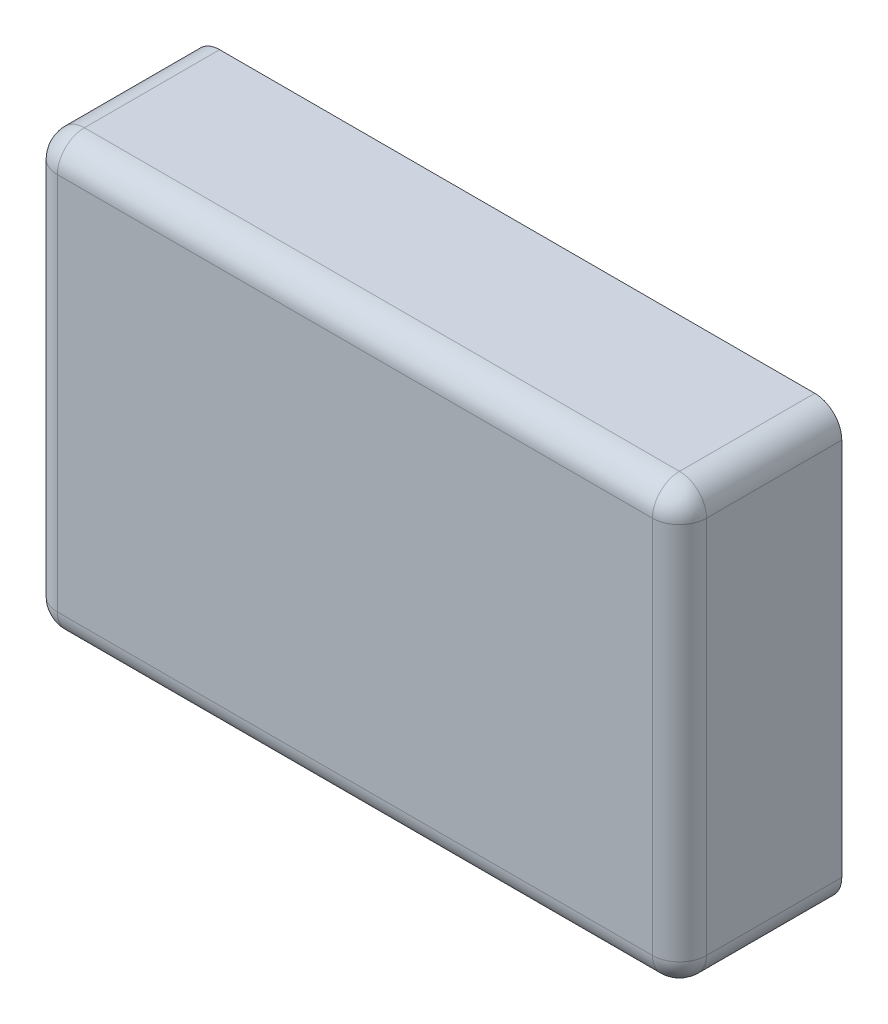
ISO-10303-21;
HEADER;
FILE_DESCRIPTION(('STEP AP214'),'2;1');
FILE_NAME('part.step','',(''),(''),'','','');
FILE_SCHEMA(('AUTOMOTIVE_DESIGN { 1 0 10303 214 1 1 1 1 }'));
ENDSEC;
DATA;
#1=APPLICATION_CONTEXT('core data for automotive mechanical design processes');
#2=APPLICATION_PROTOCOL_DEFINITION('international standard','automotive_design',2000,#1);
#3=PRODUCT_CONTEXT('',#1,'mechanical');
#4=PRODUCT('Part','Part','',(#3));
#5=PRODUCT_RELATED_PRODUCT_CATEGORY('part','',(#4));
#6=PRODUCT_DEFINITION_FORMATION('','',#4);
#7=PRODUCT_DEFINITION_CONTEXT('part definition',#1,'design');
#8=PRODUCT_DEFINITION('design','',#6,#7);
#9=PRODUCT_DEFINITION_SHAPE('','',#8);
#10=(LENGTH_UNIT() NAMED_UNIT(*) SI_UNIT(.MILLI.,.METRE.));
#11=(NAMED_UNIT(*) PLANE_ANGLE_UNIT() SI_UNIT($,.RADIAN.));
#12=(NAMED_UNIT(*) SI_UNIT($,.STERADIAN.) SOLID_ANGLE_UNIT());
#13=UNCERTAINTY_MEASURE_WITH_UNIT(LENGTH_MEASURE(1.E-05),#10,'distance_accuracy_value','');
#14=(GEOMETRIC_REPRESENTATION_CONTEXT(3) GLOBAL_UNCERTAINTY_ASSIGNED_CONTEXT((#13)) GLOBAL_UNIT_ASSIGNED_CONTEXT((#10,
#11,#12)) REPRESENTATION_CONTEXT('',''));
#15=CARTESIAN_POINT('',(0.,0.,0.));
#16=DIRECTION('',(0.,0.,1.));
#17=DIRECTION('',(1.,0.,0.));
#18=AXIS2_PLACEMENT_3D('',#15,#16,#17);
#19=CARTESIAN_POINT('',(0.55,-0.4,0.55));
#20=DIRECTION('',(0.,1.,0.));
#21=DIRECTION('',(1.,0.,0.));
#22=AXIS2_PLACEMENT_3D('',#19,#20,#21);
#23=CYLINDRICAL_SURFACE('',#22,0.05);
#24=CARTESIAN_POINT('',(0.55,-0.35,0.55));
#25=DIRECTION('',(0.,1.,0.));
#26=DIRECTION('',(1.,0.,0.));
#27=AXIS2_PLACEMENT_3D('',#24,#25,#26);
#28=CIRCLE('',#27,0.05);
#29=CARTESIAN_POINT('',(0.55,-0.35,0.6));
#30=VERTEX_POINT('',#29);
#31=CARTESIAN_POINT('',(0.6,-0.35,0.55));
#32=VERTEX_POINT('',#31);
#33=EDGE_CURVE('E27',#30,#32,#28,.T.);
#34=ORIENTED_EDGE('',*,*,#33,.T.);
#35=DIRECTION('',(0.,1.,0.));
#36=VECTOR('',#35,1.);
#37=CARTESIAN_POINT('',(0.6,-0.4,0.55));
#38=LINE('',#37,#36);
#39=CARTESIAN_POINT('',(0.6,0.35,0.55));
#40=VERTEX_POINT('',#39);
#41=EDGE_CURVE('E206',#32,#40,#38,.T.);
#42=ORIENTED_EDGE('',*,*,#41,.T.);
#43=CARTESIAN_POINT('',(0.55,0.35,0.55));
#44=DIRECTION('',(0.,-1.,0.));
#45=DIRECTION('',(1.,0.,0.));
#46=AXIS2_PLACEMENT_3D('',#43,#44,#45);
#47=CIRCLE('',#46,0.05);
#48=CARTESIAN_POINT('',(0.55,0.35,0.6));
#49=VERTEX_POINT('',#48);
#50=EDGE_CURVE('E11',#40,#49,#47,.T.);
#51=ORIENTED_EDGE('',*,*,#50,.T.);
#52=DIRECTION('',(0.,1.,0.));
#53=VECTOR('',#52,1.);
#54=CARTESIAN_POINT('',(0.55,-0.4,0.6));
#55=LINE('',#54,#53);
#56=EDGE_CURVE('E178',#30,#49,#55,.T.);
#57=ORIENTED_EDGE('',*,*,#56,.F.);
#58=EDGE_LOOP('',(#34,#42,#51,#57));
#59=FACE_BOUND('',#58,.T.);
#60=ADVANCED_FACE('F16',(#59),#23,.T.);
#61=CARTESIAN_POINT('',(0.55,0.35,0.55));
#62=DIRECTION('',(0.,-1.,0.));
#63=DIRECTION('',(1.,0.,0.));
#64=AXIS2_PLACEMENT_3D('',#61,#62,#63);
#65=SPHERICAL_SURFACE('',#64,0.05);
#66=CARTESIAN_POINT('',(0.55,0.35,0.55));
#67=DIRECTION('',(0.,0.,-1.));
#68=DIRECTION('',(1.,0.,0.));
#69=AXIS2_PLACEMENT_3D('',#66,#67,#68);
#70=CIRCLE('',#69,0.05);
#71=CARTESIAN_POINT('',(0.55,0.4,0.55));
#72=VERTEX_POINT('',#71);
#73=EDGE_CURVE('E184',#72,#40,#70,.T.);
#74=ORIENTED_EDGE('',*,*,#73,.F.);
#75=CARTESIAN_POINT('',(0.55,0.35,0.55));
#76=DIRECTION('',(1.,0.,0.));
#77=DIRECTION('',(0.,0.,1.));
#78=AXIS2_PLACEMENT_3D('',#75,#76,#77);
#79=CIRCLE('',#78,0.05);
#80=EDGE_CURVE('E196',#72,#49,#79,.T.);
#81=ORIENTED_EDGE('',*,*,#80,.T.);
#82=ORIENTED_EDGE('',*,*,#50,.F.);
#83=EDGE_LOOP('',(#74,#81,#82));
#84=FACE_BOUND('',#83,.T.);
#85=ADVANCED_FACE('F283',(#84),#65,.T.);
#86=CARTESIAN_POINT('',(0.55,-0.35,0.55));
#87=DIRECTION('',(0.,0.,-1.));
#88=DIRECTION('',(1.,0.,0.));
#89=AXIS2_PLACEMENT_3D('',#86,#87,#88);
#90=SPHERICAL_SURFACE('',#89,0.05);
#91=ORIENTED_EDGE('',*,*,#33,.F.);
#92=CARTESIAN_POINT('',(0.55,-0.35,0.55));
#93=DIRECTION('',(1.,0.,0.));
#94=DIRECTION('',(0.,-1.,0.));
#95=AXIS2_PLACEMENT_3D('',#92,#93,#94);
#96=CIRCLE('',#95,0.05);
#97=CARTESIAN_POINT('',(0.55,-0.4,0.55));
#98=VERTEX_POINT('',#97);
#99=EDGE_CURVE('E192',#30,#98,#96,.T.);
#100=ORIENTED_EDGE('',*,*,#99,.T.);
#101=CARTESIAN_POINT('',(0.55,-0.35,0.55));
#102=DIRECTION('',(0.,0.,-1.));
#103=DIRECTION('',(1.,0.,0.));
#104=AXIS2_PLACEMENT_3D('',#101,#102,#103);
#105=CIRCLE('',#104,0.05);
#106=EDGE_CURVE('E172',#32,#98,#105,.T.);
#107=ORIENTED_EDGE('',*,*,#106,.F.);
#108=EDGE_LOOP('',(#91,#100,#107));
#109=FACE_BOUND('',#108,.T.);
#110=ADVANCED_FACE('F267',(#109),#90,.T.);
#111=CARTESIAN_POINT('',(-0.6,0.35,0.55));
#112=DIRECTION('',(1.,0.,0.));
#113=DIRECTION('',(0.,1.,0.));
#114=AXIS2_PLACEMENT_3D('',#111,#112,#113);
#115=CYLINDRICAL_SURFACE('',#114,0.05);
#116=CARTESIAN_POINT('',(-0.55,0.35,0.55));
#117=DIRECTION('',(1.,0.,0.));
#118=DIRECTION('',(0.,0.,1.));
#119=AXIS2_PLACEMENT_3D('',#116,#117,#118);
#120=CIRCLE('',#119,0.05);
#121=CARTESIAN_POINT('',(-0.55,0.4,0.55));
#122=VERTEX_POINT('',#121);
#123=CARTESIAN_POINT('',(-0.55,0.35,0.6));
#124=VERTEX_POINT('',#123);
#125=EDGE_CURVE('E20',#122,#124,#120,.T.);
#126=ORIENTED_EDGE('',*,*,#125,.T.);
#127=DIRECTION('',(1.,0.,0.));
#128=VECTOR('',#127,1.);
#129=CARTESIAN_POINT('',(-0.6,0.35,0.6));
#130=LINE('',#129,#128);
#131=EDGE_CURVE('E182',#124,#49,#130,.T.);
#132=ORIENTED_EDGE('',*,*,#131,.T.);
#133=ORIENTED_EDGE('',*,*,#80,.F.);
#134=DIRECTION('',(1.,0.,0.));
#135=VECTOR('',#134,1.);
#136=CARTESIAN_POINT('',(-0.6,0.4,0.55));
#137=LINE('',#136,#135);
#138=EDGE_CURVE('E204',#122,#72,#137,.T.);
#139=ORIENTED_EDGE('',*,*,#138,.F.);
#140=EDGE_LOOP('',(#126,#132,#133,#139));
#141=FACE_BOUND('',#140,.T.);
#142=ADVANCED_FACE('F286',(#141),#115,.T.);
#143=CARTESIAN_POINT('',(-0.6,-0.35,0.55));
#144=DIRECTION('',(1.,0.,0.));
#145=DIRECTION('',(0.,-1.,0.));
#146=AXIS2_PLACEMENT_3D('',#143,#144,#145);
#147=CYLINDRICAL_SURFACE('',#146,0.05);
#148=CARTESIAN_POINT('',(-0.55,-0.35,0.55));
#149=DIRECTION('',(1.,0.,0.));
#150=DIRECTION('',(0.,-1.,0.));
#151=AXIS2_PLACEMENT_3D('',#148,#149,#150);
#152=CIRCLE('',#151,0.05);
#153=CARTESIAN_POINT('',(-0.55,-0.35,0.6));
#154=VERTEX_POINT('',#153);
#155=CARTESIAN_POINT('',(-0.55,-0.4,0.55));
#156=VERTEX_POINT('',#155);
#157=EDGE_CURVE('E117',#154,#156,#152,.T.);
#158=ORIENTED_EDGE('',*,*,#157,.T.);
#159=DIRECTION('',(1.,0.,0.));
#160=VECTOR('',#159,1.);
#161=CARTESIAN_POINT('',(-0.6,-0.4,0.55));
#162=LINE('',#161,#160);
#163=EDGE_CURVE('E231',#156,#98,#162,.T.);
#164=ORIENTED_EDGE('',*,*,#163,.T.);
#165=ORIENTED_EDGE('',*,*,#99,.F.);
#166=DIRECTION('',(1.,0.,0.));
#167=VECTOR('',#166,1.);
#168=CARTESIAN_POINT('',(-0.6,-0.35,0.6));
#169=LINE('',#168,#167);
#170=EDGE_CURVE('E183',#154,#30,#169,.T.);
#171=ORIENTED_EDGE('',*,*,#170,.F.);
#172=EDGE_LOOP('',(#158,#164,#165,#171));
#173=FACE_BOUND('',#172,.T.);
#174=ADVANCED_FACE('F290',(#173),#147,.T.);
#175=CARTESIAN_POINT('',(-0.6,-0.4,0.6));
#176=DIRECTION('',(0.,0.,1.));
#177=DIRECTION('',(1.,0.,0.));
#178=AXIS2_PLACEMENT_3D('',#175,#176,#177);
#179=PLANE('',#178);
#180=DIRECTION('',(0.,1.,0.));
#181=VECTOR('',#180,1.);
#182=CARTESIAN_POINT('',(-0.55,-0.4,0.6));
#183=LINE('',#182,#181);
#184=EDGE_CURVE('E123',#154,#124,#183,.T.);
#185=ORIENTED_EDGE('',*,*,#184,.F.);
#186=ORIENTED_EDGE('',*,*,#170,.T.);
#187=ORIENTED_EDGE('',*,*,#56,.T.);
#188=ORIENTED_EDGE('',*,*,#131,.F.);
#189=EDGE_LOOP('',(#185,#186,#187,#188));
#190=FACE_BOUND('',#189,.T.);
#191=ADVANCED_FACE('F289',(#190),#179,.T.);
#192=CARTESIAN_POINT('',(-0.55,0.35,0.55));
#193=DIRECTION('',(0.,-1.,0.));
#194=DIRECTION('',(-1.,0.,0.));
#195=AXIS2_PLACEMENT_3D('',#192,#193,#194);
#196=SPHERICAL_SURFACE('',#195,0.05);
#197=CARTESIAN_POINT('',(-0.55,0.35,0.55));
#198=DIRECTION('',(0.,0.,1.));
#199=DIRECTION('',(-1.,0.,0.));
#200=AXIS2_PLACEMENT_3D('',#197,#198,#199);
#201=CIRCLE('',#200,0.05);
#202=CARTESIAN_POINT('',(-0.6,0.35,0.55));
#203=VERTEX_POINT('',#202);
#204=EDGE_CURVE('E135',#122,#203,#201,.T.);
#205=ORIENTED_EDGE('',*,*,#204,.T.);
#206=CARTESIAN_POINT('',(-0.55,0.35,0.55));
#207=DIRECTION('',(0.,1.,0.));
#208=DIRECTION('',(-1.,0.,0.));
#209=AXIS2_PLACEMENT_3D('',#206,#207,#208);
#210=CIRCLE('',#209,0.05);
#211=EDGE_CURVE('E141',#203,#124,#210,.T.);
#212=ORIENTED_EDGE('',*,*,#211,.T.);
#213=ORIENTED_EDGE('',*,*,#125,.F.);
#214=EDGE_LOOP('',(#205,#212,#213));
#215=FACE_BOUND('',#214,.T.);
#216=ADVANCED_FACE('F18',(#215),#196,.T.);
#217=CARTESIAN_POINT('',(-0.55,-0.35,0.55));
#218=DIRECTION('',(0.,0.,-1.));
#219=DIRECTION('',(-1.,0.,0.));
#220=AXIS2_PLACEMENT_3D('',#217,#218,#219);
#221=SPHERICAL_SURFACE('',#220,0.05);
#222=CARTESIAN_POINT('',(-0.55,-0.35,0.55));
#223=DIRECTION('',(0.,-1.,0.));
#224=DIRECTION('',(-1.,0.,0.));
#225=AXIS2_PLACEMENT_3D('',#222,#223,#224);
#226=CIRCLE('',#225,0.05);
#227=CARTESIAN_POINT('',(-0.6,-0.35,0.55));
#228=VERTEX_POINT('',#227);
#229=EDGE_CURVE('E112',#154,#228,#226,.T.);
#230=ORIENTED_EDGE('',*,*,#229,.T.);
#231=CARTESIAN_POINT('',(-0.55,-0.35,0.55));
#232=DIRECTION('',(0.,0.,1.));
#233=DIRECTION('',(-1.,0.,0.));
#234=AXIS2_PLACEMENT_3D('',#231,#232,#233);
#235=CIRCLE('',#234,0.05);
#236=EDGE_CURVE('E115',#228,#156,#235,.T.);
#237=ORIENTED_EDGE('',*,*,#236,.T.);
#238=ORIENTED_EDGE('',*,*,#157,.F.);
#239=EDGE_LOOP('',(#230,#237,#238));
#240=FACE_BOUND('',#239,.T.);
#241=ADVANCED_FACE('F114',(#240),#221,.T.);
#242=CARTESIAN_POINT('',(0.6,-0.4,0.3));
#243=DIRECTION('',(1.,0.,0.));
#244=DIRECTION('',(0.,1.,0.));
#245=AXIS2_PLACEMENT_3D('',#242,#243,#244);
#246=PLANE('',#245);
#247=DIRECTION('',(0.,1.,0.));
#248=VECTOR('',#247,1.);
#249=CARTESIAN_POINT('',(0.6,-0.4,0.3));
#250=LINE('',#249,#248);
#251=CARTESIAN_POINT('',(0.6,-0.35,0.3));
#252=VERTEX_POINT('',#251);
#253=CARTESIAN_POINT('',(0.6,0.35,0.3));
#254=VERTEX_POINT('',#253);
#255=EDGE_CURVE('E166',#252,#254,#250,.T.);
#256=ORIENTED_EDGE('',*,*,#255,.T.);
#257=DIRECTION('',(0.,0.,1.));
#258=VECTOR('',#257,1.);
#259=CARTESIAN_POINT('',(0.6,0.35,0.3));
#260=LINE('',#259,#258);
#261=EDGE_CURVE('E188',#254,#40,#260,.T.);
#262=ORIENTED_EDGE('',*,*,#261,.T.);
#263=ORIENTED_EDGE('',*,*,#41,.F.);
#264=DIRECTION('',(0.,0.,1.));
#265=VECTOR('',#264,1.);
#266=CARTESIAN_POINT('',(0.6,-0.35,0.3));
#267=LINE('',#266,#265);
#268=EDGE_CURVE('E168',#252,#32,#267,.T.);
#269=ORIENTED_EDGE('',*,*,#268,.F.);
#270=EDGE_LOOP('',(#256,#262,#263,#269));
#271=FACE_BOUND('',#270,.T.);
#272=ADVANCED_FACE('F264',(#271),#246,.T.);
#273=CARTESIAN_POINT('',(0.55,0.35,0.3));
#274=DIRECTION('',(0.,0.,1.));
#275=DIRECTION('',(1.,0.,0.));
#276=AXIS2_PLACEMENT_3D('',#273,#274,#275);
#277=CYLINDRICAL_SURFACE('',#276,0.05);
#278=CARTESIAN_POINT('',(0.55,0.35,0.3));
#279=DIRECTION('',(0.,0.,1.));
#280=DIRECTION('',(0.,-1.,0.));
#281=AXIS2_PLACEMENT_3D('',#278,#279,#280);
#282=CIRCLE('',#281,0.05);
#283=CARTESIAN_POINT('',(0.55,0.4,0.3));
#284=VERTEX_POINT('',#283);
#285=EDGE_CURVE('E162',#254,#284,#282,.T.);
#286=ORIENTED_EDGE('',*,*,#285,.T.);
#287=DIRECTION('',(0.,0.,1.));
#288=VECTOR('',#287,1.);
#289=CARTESIAN_POINT('',(0.55,0.4,0.3));
#290=LINE('',#289,#288);
#291=EDGE_CURVE('E173',#284,#72,#290,.T.);
#292=ORIENTED_EDGE('',*,*,#291,.T.);
#293=ORIENTED_EDGE('',*,*,#73,.T.);
#294=ORIENTED_EDGE('',*,*,#261,.F.);
#295=EDGE_LOOP('',(#286,#292,#293,#294));
#296=FACE_BOUND('',#295,.T.);
#297=ADVANCED_FACE('F280',(#296),#277,.T.);
#298=CARTESIAN_POINT('',(0.55,-0.35,0.3));
#299=DIRECTION('',(0.,0.,1.));
#300=DIRECTION('',(1.,0.,0.));
#301=AXIS2_PLACEMENT_3D('',#298,#299,#300);
#302=CYLINDRICAL_SURFACE('',#301,0.05);
#303=CARTESIAN_POINT('',(0.55,-0.35,0.3));
#304=DIRECTION('',(0.,0.,-1.));
#305=DIRECTION('',(0.,-1.,0.));
#306=AXIS2_PLACEMENT_3D('',#303,#304,#305);
#307=CIRCLE('',#306,0.05);
#308=CARTESIAN_POINT('',(0.55,-0.4,0.3));
#309=VERTEX_POINT('',#308);
#310=EDGE_CURVE('E225',#252,#309,#307,.T.);
#311=ORIENTED_EDGE('',*,*,#310,.F.);
#312=ORIENTED_EDGE('',*,*,#268,.T.);
#313=ORIENTED_EDGE('',*,*,#106,.T.);
#314=DIRECTION('',(0.,0.,1.));
#315=VECTOR('',#314,1.);
#316=CARTESIAN_POINT('',(0.55,-0.4,0.3));
#317=LINE('',#316,#315);
#318=EDGE_CURVE('E237',#309,#98,#317,.T.);
#319=ORIENTED_EDGE('',*,*,#318,.F.);
#320=EDGE_LOOP('',(#311,#312,#313,#319));
#321=FACE_BOUND('',#320,.T.);
#322=ADVANCED_FACE('F271',(#321),#302,.T.);
#323=CARTESIAN_POINT('',(-0.6,0.4,0.3));
#324=DIRECTION('',(0.,1.,0.));
#325=DIRECTION('',(1.,0.,0.));
#326=AXIS2_PLACEMENT_3D('',#323,#324,#325);
#327=PLANE('',#326);
#328=DIRECTION('',(1.,0.,0.));
#329=VECTOR('',#328,1.);
#330=CARTESIAN_POINT('',(-0.6,0.4,0.3));
#331=LINE('',#330,#329);
#332=CARTESIAN_POINT('',(-0.55,0.4,0.3));
#333=VERTEX_POINT('',#332);
#334=EDGE_CURVE('E167',#333,#284,#331,.T.);
#335=ORIENTED_EDGE('',*,*,#334,.F.);
#336=DIRECTION('',(0.,0.,1.));
#337=VECTOR('',#336,1.);
#338=CARTESIAN_POINT('',(-0.55,0.4,0.3));
#339=LINE('',#338,#337);
#340=EDGE_CURVE('E124',#333,#122,#339,.T.);
#341=ORIENTED_EDGE('',*,*,#340,.T.);
#342=ORIENTED_EDGE('',*,*,#138,.T.);
#343=ORIENTED_EDGE('',*,*,#291,.F.);
#344=EDGE_LOOP('',(#335,#341,#342,#343));
#345=FACE_BOUND('',#344,.T.);
#346=ADVANCED_FACE('F402',(#345),#327,.T.);
#347=CARTESIAN_POINT('',(-0.6,-0.4,0.3));
#348=DIRECTION('',(0.,1.,0.));
#349=DIRECTION('',(1.,0.,0.));
#350=AXIS2_PLACEMENT_3D('',#347,#348,#349);
#351=PLANE('',#350);
#352=DIRECTION('',(1.,0.,0.));
#353=VECTOR('',#352,1.);
#354=CARTESIAN_POINT('',(-0.6,-0.4,0.3));
#355=LINE('',#354,#353);
#356=CARTESIAN_POINT('',(-0.55,-0.4,0.3));
#357=VERTEX_POINT('',#356);
#358=EDGE_CURVE('E228',#357,#309,#355,.T.);
#359=ORIENTED_EDGE('',*,*,#358,.T.);
#360=ORIENTED_EDGE('',*,*,#318,.T.);
#361=ORIENTED_EDGE('',*,*,#163,.F.);
#362=DIRECTION('',(0.,0.,1.));
#363=VECTOR('',#362,1.);
#364=CARTESIAN_POINT('',(-0.55,-0.4,0.3));
#365=LINE('',#364,#363);
#366=EDGE_CURVE('E133',#357,#156,#365,.T.);
#367=ORIENTED_EDGE('',*,*,#366,.F.);
#368=EDGE_LOOP('',(#359,#360,#361,#367));
#369=FACE_BOUND('',#368,.T.);
#370=ADVANCED_FACE('F377',(#369),#351,.F.);
#371=CARTESIAN_POINT('',(-0.55,-0.4,0.55));
#372=DIRECTION('',(0.,1.,0.));
#373=DIRECTION('',(-1.,0.,0.));
#374=AXIS2_PLACEMENT_3D('',#371,#372,#373);
#375=CYLINDRICAL_SURFACE('',#374,0.05);
#376=ORIENTED_EDGE('',*,*,#229,.F.);
#377=ORIENTED_EDGE('',*,*,#184,.T.);
#378=ORIENTED_EDGE('',*,*,#211,.F.);
#379=DIRECTION('',(0.,1.,0.));
#380=VECTOR('',#379,1.);
#381=CARTESIAN_POINT('',(-0.6,-0.4,0.55));
#382=LINE('',#381,#380);
#383=EDGE_CURVE('E138',#228,#203,#382,.T.);
#384=ORIENTED_EDGE('',*,*,#383,.F.);
#385=EDGE_LOOP('',(#376,#377,#378,#384));
#386=FACE_BOUND('',#385,.T.);
#387=ADVANCED_FACE('F139',(#386),#375,.T.);
#388=CARTESIAN_POINT('',(-0.55,0.35,0.3));
#389=DIRECTION('',(0.,0.,1.));
#390=DIRECTION('',(-1.,0.,0.));
#391=AXIS2_PLACEMENT_3D('',#388,#389,#390);
#392=CYLINDRICAL_SURFACE('',#391,0.05);
#393=CARTESIAN_POINT('',(-0.55,0.35,0.3));
#394=DIRECTION('',(0.,0.,-1.));
#395=DIRECTION('',(0.,-1.,0.));
#396=AXIS2_PLACEMENT_3D('',#393,#394,#395);
#397=CIRCLE('',#396,0.05);
#398=CARTESIAN_POINT('',(-0.6,0.35,0.3));
#399=VERTEX_POINT('',#398);
#400=EDGE_CURVE('E177',#399,#333,#397,.T.);
#401=ORIENTED_EDGE('',*,*,#400,.F.);
#402=DIRECTION('',(0.,0.,1.));
#403=VECTOR('',#402,1.);
#404=CARTESIAN_POINT('',(-0.6,0.35,0.3));
#405=LINE('',#404,#403);
#406=EDGE_CURVE('E146',#399,#203,#405,.T.);
#407=ORIENTED_EDGE('',*,*,#406,.T.);
#408=ORIENTED_EDGE('',*,*,#204,.F.);
#409=ORIENTED_EDGE('',*,*,#340,.F.);
#410=EDGE_LOOP('',(#401,#407,#408,#409));
#411=FACE_BOUND('',#410,.T.);
#412=ADVANCED_FACE('F364',(#411),#392,.T.);
#413=CARTESIAN_POINT('',(-0.55,-0.35,0.3));
#414=DIRECTION('',(0.,0.,1.));
#415=DIRECTION('',(-1.,0.,0.));
#416=AXIS2_PLACEMENT_3D('',#413,#414,#415);
#417=CYLINDRICAL_SURFACE('',#416,0.05);
#418=CARTESIAN_POINT('',(-0.55,-0.35,0.3));
#419=DIRECTION('',(0.,0.,1.));
#420=DIRECTION('',(0.,-1.,0.));
#421=AXIS2_PLACEMENT_3D('',#418,#419,#420);
#422=CIRCLE('',#421,0.05);
#423=CARTESIAN_POINT('',(-0.6,-0.35,0.3));
#424=VERTEX_POINT('',#423);
#425=EDGE_CURVE('E298',#424,#357,#422,.T.);
#426=ORIENTED_EDGE('',*,*,#425,.T.);
#427=ORIENTED_EDGE('',*,*,#366,.T.);
#428=ORIENTED_EDGE('',*,*,#236,.F.);
#429=DIRECTION('',(0.,0.,1.));
#430=VECTOR('',#429,1.);
#431=CARTESIAN_POINT('',(-0.6,-0.35,0.3));
#432=LINE('',#431,#430);
#433=EDGE_CURVE('E131',#424,#228,#432,.T.);
#434=ORIENTED_EDGE('',*,*,#433,.F.);
#435=EDGE_LOOP('',(#426,#427,#428,#434));
#436=FACE_BOUND('',#435,.T.);
#437=ADVANCED_FACE('F129',(#436),#417,.T.);
#438=CARTESIAN_POINT('',(-0.6,-0.4,0.3));
#439=DIRECTION('',(0.,0.,1.));
#440=DIRECTION('',(1.,0.,0.));
#441=AXIS2_PLACEMENT_3D('',#438,#439,#440);
#442=PLANE('',#441);
#443=DIRECTION('',(0.,1.,0.));
#444=VECTOR('',#443,1.);
#445=CARTESIAN_POINT('',(-0.6,-0.4,0.3));
#446=LINE('',#445,#444);
#447=EDGE_CURVE('E150',#424,#399,#446,.T.);
#448=ORIENTED_EDGE('',*,*,#447,.T.);
#449=ORIENTED_EDGE('',*,*,#400,.T.);
#450=ORIENTED_EDGE('',*,*,#334,.T.);
#451=ORIENTED_EDGE('',*,*,#285,.F.);
#452=ORIENTED_EDGE('',*,*,#255,.F.);
#453=ORIENTED_EDGE('',*,*,#310,.T.);
#454=ORIENTED_EDGE('',*,*,#358,.F.);
#455=ORIENTED_EDGE('',*,*,#425,.F.);
#456=EDGE_LOOP('',(#448,#449,#450,#451,#452,#453,#454,#455));
#457=FACE_BOUND('',#456,.T.);
#458=ADVANCED_FACE('F277',(#457),#442,.F.);
#459=CARTESIAN_POINT('',(-0.6,-0.4,0.3));
#460=DIRECTION('',(1.,0.,0.));
#461=DIRECTION('',(0.,1.,0.));
#462=AXIS2_PLACEMENT_3D('',#459,#460,#461);
#463=PLANE('',#462);
#464=ORIENTED_EDGE('',*,*,#447,.F.);
#465=ORIENTED_EDGE('',*,*,#433,.T.);
#466=ORIENTED_EDGE('',*,*,#383,.T.);
#467=ORIENTED_EDGE('',*,*,#406,.F.);
#468=EDGE_LOOP('',(#464,#465,#466,#467));
#469=FACE_BOUND('',#468,.T.);
#470=ADVANCED_FACE('F148',(#469),#463,.F.);
#471=CLOSED_SHELL('',(#60,#85,#110,#142,#174,#191,#216,#241,#272,#297,#322,#346,#370,#387,#412,
#437,#458,#470));
#472=MANIFOLD_SOLID_BREP('B1',#471);
#473=ADVANCED_BREP_SHAPE_REPRESENTATION('',(#18,#472),#14);
#474=SHAPE_DEFINITION_REPRESENTATION(#9,#473);
ENDSEC;
END-ISO-10303-21;
